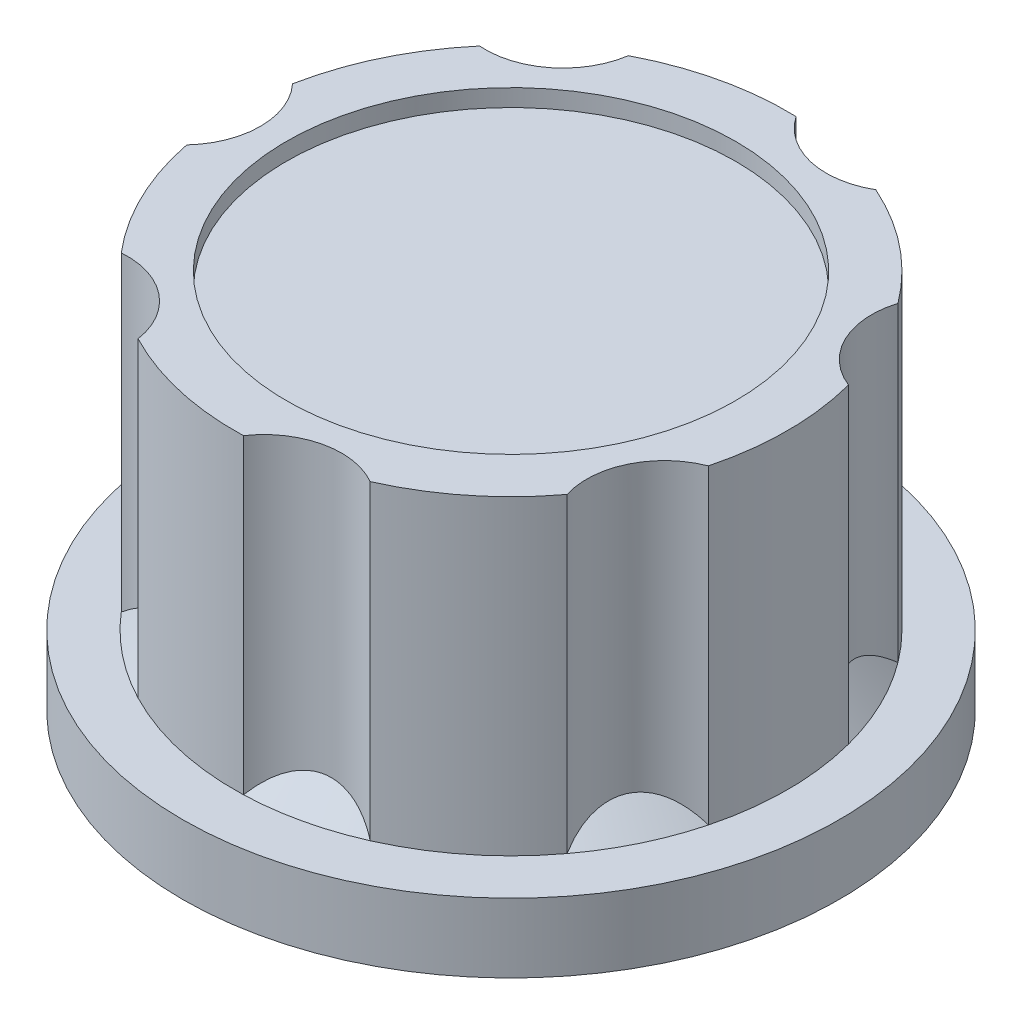
ISO-10303-21;
HEADER;
FILE_DESCRIPTION(('STEP AP214'),'2;1');
FILE_NAME('part.step','',(''),(''),'','','');
FILE_SCHEMA(('AUTOMOTIVE_DESIGN { 1 0 10303 214 1 1 1 1 }'));
ENDSEC;
DATA;
#1=APPLICATION_CONTEXT('core data for automotive mechanical design processes');
#2=APPLICATION_PROTOCOL_DEFINITION('international standard','automotive_design',2000,#1);
#3=PRODUCT_CONTEXT('',#1,'mechanical');
#4=PRODUCT('Part','Part','',(#3));
#5=PRODUCT_RELATED_PRODUCT_CATEGORY('part','',(#4));
#6=PRODUCT_DEFINITION_FORMATION('','',#4);
#7=PRODUCT_DEFINITION_CONTEXT('part definition',#1,'design');
#8=PRODUCT_DEFINITION('design','',#6,#7);
#9=PRODUCT_DEFINITION_SHAPE('','',#8);
#10=(LENGTH_UNIT() NAMED_UNIT(*) SI_UNIT(.MILLI.,.METRE.));
#11=(NAMED_UNIT(*) PLANE_ANGLE_UNIT() SI_UNIT($,.RADIAN.));
#12=(NAMED_UNIT(*) SI_UNIT($,.STERADIAN.) SOLID_ANGLE_UNIT());
#13=UNCERTAINTY_MEASURE_WITH_UNIT(LENGTH_MEASURE(1.E-05),#10,'distance_accuracy_value','');
#14=(GEOMETRIC_REPRESENTATION_CONTEXT(3) GLOBAL_UNCERTAINTY_ASSIGNED_CONTEXT((#13)) GLOBAL_UNIT_ASSIGNED_CONTEXT((#10,
#11,#12)) REPRESENTATION_CONTEXT('',''));
#15=CARTESIAN_POINT('',(0.,0.,0.));
#16=DIRECTION('',(0.,0.,1.));
#17=DIRECTION('',(1.,0.,0.));
#18=AXIS2_PLACEMENT_3D('',#15,#16,#17);
#19=CARTESIAN_POINT('',(0.,0.,0.));
#20=DIRECTION('',(0.,-1.,0.));
#21=DIRECTION('',(0.,0.,-1.));
#22=AXIS2_PLACEMENT_3D('',#19,#20,#21);
#23=CYLINDRICAL_SURFACE('',#22,8.);
#24=DIRECTION('',(0.,1.,0.));
#25=VECTOR('',#24,1.);
#26=CARTESIAN_POINT('',(3.24065428680593,7.25,7.31424362414914));
#27=LINE('',#26,#25);
#28=CARTESIAN_POINT('',(3.24065428680592,11.,7.31424362414914));
#29=VERTEX_POINT('',#28);
#30=CARTESIAN_POINT('',(3.24065428680593,2.,7.31424362414914));
#31=VERTEX_POINT('',#30);
#32=EDGE_CURVE('E130',#29,#31,#27,.F.);
#33=ORIENTED_EDGE('',*,*,#32,.T.);
#34=CARTESIAN_POINT('',(0.,2.,0.));
#35=DIRECTION('',(0.,-1.,0.));
#36=DIRECTION('',(0.,0.,-1.));
#37=AXIS2_PLACEMENT_3D('',#34,#35,#36);
#38=CIRCLE('',#37,8.);
#39=CARTESIAN_POINT('',(6.40974684715135,1.99999999999999,4.78697664036847));
#40=VERTEX_POINT('',#39);
#41=EDGE_CURVE('E302',#40,#31,#38,.T.);
#42=ORIENTED_EDGE('',*,*,#41,.F.);
#43=DIRECTION('',(0.,1.,0.));
#44=VECTOR('',#43,1.);
#45=CARTESIAN_POINT('',(6.40974684715135,7.25,4.78697664036846));
#46=LINE('',#45,#44);
#47=CARTESIAN_POINT('',(6.40974684715135,11.,4.78697664036846));
#48=VERTEX_POINT('',#47);
#49=EDGE_CURVE('E430',#40,#48,#46,.T.);
#50=ORIENTED_EDGE('',*,*,#49,.T.);
#51=CARTESIAN_POINT('',(0.,11.,0.));
#52=DIRECTION('',(0.,-1.,0.));
#53=DIRECTION('',(0.,0.,-1.));
#54=AXIS2_PLACEMENT_3D('',#51,#52,#53);
#55=CIRCLE('',#54,8.);
#56=EDGE_CURVE('E306',#48,#29,#55,.T.);
#57=ORIENTED_EDGE('',*,*,#56,.T.);
#58=EDGE_LOOP('',(#33,#42,#50,#57));
#59=FACE_BOUND('',#58,.T.);
#60=ADVANCED_FACE('F41',(#59),#23,.T.);
#61=CARTESIAN_POINT('',(0.253802748415934,1.99999999999999,7.99597299675884));
#62=VERTEX_POINT('',#61);
#63=CARTESIAN_POINT('',(-3.69799103662757,2.,7.09400185318711));
#64=VERTEX_POINT('',#63);
#65=EDGE_CURVE('E158',#62,#64,#38,.T.);
#66=ORIENTED_EDGE('',*,*,#65,.F.);
#67=DIRECTION('',(0.,1.,0.));
#68=VECTOR('',#67,1.);
#69=CARTESIAN_POINT('',(0.253802748415934,7.25,7.99597299675884));
#70=LINE('',#69,#68);
#71=CARTESIAN_POINT('',(0.253802748415933,11.,7.99597299675884));
#72=VERTEX_POINT('',#71);
#73=EDGE_CURVE('E311',#62,#72,#70,.T.);
#74=ORIENTED_EDGE('',*,*,#73,.T.);
#75=CARTESIAN_POINT('',(-3.69799103662758,11.,7.09400185318711));
#76=VERTEX_POINT('',#75);
#77=EDGE_CURVE('E467',#72,#76,#55,.T.);
#78=ORIENTED_EDGE('',*,*,#77,.T.);
#79=DIRECTION('',(0.,1.,0.));
#80=VECTOR('',#79,1.);
#81=CARTESIAN_POINT('',(-3.69799103662757,7.25,7.09400185318711));
#82=LINE('',#81,#80);
#83=EDGE_CURVE('E131',#76,#64,#82,.F.);
#84=ORIENTED_EDGE('',*,*,#83,.T.);
#85=EDGE_LOOP('',(#66,#74,#78,#84));
#86=FACE_BOUND('',#85,.T.);
#87=ADVANCED_FACE('F291',(#86),#23,.T.);
#88=CARTESIAN_POINT('',(-6.09325999650924,1.99999999999999,5.18383859846544));
#89=VERTEX_POINT('',#88);
#90=CARTESIAN_POINT('',(-7.85197368421053,2.,1.53183199550909));
#91=VERTEX_POINT('',#90);
#92=EDGE_CURVE('E143',#89,#91,#38,.T.);
#93=ORIENTED_EDGE('',*,*,#92,.F.);
#94=DIRECTION('',(0.,1.,0.));
#95=VECTOR('',#94,1.);
#96=CARTESIAN_POINT('',(-6.09325999650924,7.25,5.18383859846544));
#97=LINE('',#96,#95);
#98=CARTESIAN_POINT('',(-6.09325999650924,11.,5.18383859846544));
#99=VERTEX_POINT('',#98);
#100=EDGE_CURVE('E116',#89,#99,#97,.T.);
#101=ORIENTED_EDGE('',*,*,#100,.T.);
#102=CARTESIAN_POINT('',(-7.85197368421053,11.,1.53183199550909));
#103=VERTEX_POINT('',#102);
#104=EDGE_CURVE('E399',#99,#103,#55,.T.);
#105=ORIENTED_EDGE('',*,*,#104,.T.);
#106=DIRECTION('',(0.,1.,0.));
#107=VECTOR('',#106,1.);
#108=CARTESIAN_POINT('',(-7.85197368421052,7.25,1.53183199550909));
#109=LINE('',#108,#107);
#110=EDGE_CURVE('E146',#103,#91,#109,.F.);
#111=ORIENTED_EDGE('',*,*,#110,.T.);
#112=EDGE_LOOP('',(#93,#101,#105,#111));
#113=FACE_BOUND('',#112,.T.);
#114=ADVANCED_FACE('F144',(#113),#23,.T.);
#115=CARTESIAN_POINT('',(-7.85197368421053,1.99999999999999,-1.53183199550909));
#116=VERTEX_POINT('',#115);
#117=CARTESIAN_POINT('',(-6.09325999650925,2.,-5.18383859846544));
#118=VERTEX_POINT('',#117);
#119=EDGE_CURVE('E385',#116,#118,#38,.T.);
#120=ORIENTED_EDGE('',*,*,#119,.F.);
#121=DIRECTION('',(0.,1.,0.));
#122=VECTOR('',#121,1.);
#123=CARTESIAN_POINT('',(-7.85197368421052,7.25,-1.53183199550909));
#124=LINE('',#123,#122);
#125=CARTESIAN_POINT('',(-7.85197368421052,11.,-1.53183199550909));
#126=VERTEX_POINT('',#125);
#127=EDGE_CURVE('E440',#116,#126,#124,.T.);
#128=ORIENTED_EDGE('',*,*,#127,.T.);
#129=CARTESIAN_POINT('',(-6.09325999650924,11.,-5.18383859846544));
#130=VERTEX_POINT('',#129);
#131=EDGE_CURVE('E392',#126,#130,#55,.T.);
#132=ORIENTED_EDGE('',*,*,#131,.T.);
#133=DIRECTION('',(0.,1.,0.));
#134=VECTOR('',#133,1.);
#135=CARTESIAN_POINT('',(-6.09325999650924,7.25,-5.18383859846544));
#136=LINE('',#135,#134);
#137=EDGE_CURVE('E418',#130,#118,#136,.F.);
#138=ORIENTED_EDGE('',*,*,#137,.T.);
#139=EDGE_LOOP('',(#120,#128,#132,#138));
#140=FACE_BOUND('',#139,.T.);
#141=ADVANCED_FACE('F495',(#140),#23,.T.);
#142=CARTESIAN_POINT('',(-3.69799103662758,1.99999999999999,-7.09400185318711));
#143=VERTEX_POINT('',#142);
#144=CARTESIAN_POINT('',(0.253802748415931,2.,-7.99597299675884));
#145=VERTEX_POINT('',#144);
#146=EDGE_CURVE('E168',#143,#145,#38,.T.);
#147=ORIENTED_EDGE('',*,*,#146,.F.);
#148=DIRECTION('',(0.,1.,0.));
#149=VECTOR('',#148,1.);
#150=CARTESIAN_POINT('',(-3.69799103662758,7.25,-7.09400185318711));
#151=LINE('',#150,#149);
#152=CARTESIAN_POINT('',(-3.69799103662758,11.,-7.09400185318711));
#153=VERTEX_POINT('',#152);
#154=EDGE_CURVE('E66',#143,#153,#151,.T.);
#155=ORIENTED_EDGE('',*,*,#154,.T.);
#156=CARTESIAN_POINT('',(0.253802748415935,11.,-7.99597299675884));
#157=VERTEX_POINT('',#156);
#158=EDGE_CURVE('E169',#153,#157,#55,.T.);
#159=ORIENTED_EDGE('',*,*,#158,.T.);
#160=DIRECTION('',(0.,1.,0.));
#161=VECTOR('',#160,1.);
#162=CARTESIAN_POINT('',(0.253802748415931,7.25,-7.99597299675884));
#163=LINE('',#162,#161);
#164=EDGE_CURVE('E423',#157,#145,#163,.F.);
#165=ORIENTED_EDGE('',*,*,#164,.T.);
#166=EDGE_LOOP('',(#147,#155,#159,#165));
#167=FACE_BOUND('',#166,.T.);
#168=ADVANCED_FACE('F501',(#167),#23,.T.);
#169=CARTESIAN_POINT('',(3.24065428680593,1.99999999999999,-7.31424362414914));
#170=VERTEX_POINT('',#169);
#171=CARTESIAN_POINT('',(6.40974684715135,2.,-4.78697664036847));
#172=VERTEX_POINT('',#171);
#173=EDGE_CURVE('E167',#170,#172,#38,.T.);
#174=ORIENTED_EDGE('',*,*,#173,.F.);
#175=DIRECTION('',(0.,1.,0.));
#176=VECTOR('',#175,1.);
#177=CARTESIAN_POINT('',(3.24065428680593,7.25,-7.31424362414914));
#178=LINE('',#177,#176);
#179=CARTESIAN_POINT('',(3.24065428680593,11.,-7.31424362414914));
#180=VERTEX_POINT('',#179);
#181=EDGE_CURVE('E370',#170,#180,#178,.T.);
#182=ORIENTED_EDGE('',*,*,#181,.T.);
#183=CARTESIAN_POINT('',(6.40974684715135,11.,-4.78697664036846));
#184=VERTEX_POINT('',#183);
#185=EDGE_CURVE('E382',#180,#184,#55,.T.);
#186=ORIENTED_EDGE('',*,*,#185,.T.);
#187=DIRECTION('',(0.,1.,0.));
#188=VECTOR('',#187,1.);
#189=CARTESIAN_POINT('',(6.40974684715135,7.25,-4.78697664036846));
#190=LINE('',#189,#188);
#191=EDGE_CURVE('E95',#184,#172,#190,.F.);
#192=ORIENTED_EDGE('',*,*,#191,.T.);
#193=EDGE_LOOP('',(#174,#182,#186,#192));
#194=FACE_BOUND('',#193,.T.);
#195=ADVANCED_FACE('F278',(#194),#23,.T.);
#196=CARTESIAN_POINT('',(0.,0.,0.));
#197=DIRECTION('',(0.,1.,0.));
#198=DIRECTION('',(0.,0.,1.));
#199=AXIS2_PLACEMENT_3D('',#196,#197,#198);
#200=PLANE('',#199);
#201=CARTESIAN_POINT('',(0.,0.,0.));
#202=DIRECTION('',(0.,-1.,0.));
#203=DIRECTION('',(0.,0.,-1.));
#204=AXIS2_PLACEMENT_3D('',#201,#202,#203);
#205=CIRCLE('',#204,3.6);
#206=CARTESIAN_POINT('',(0.,0.,-3.6));
#207=VERTEX_POINT('',#206);
#208=EDGE_CURVE('E409',#207,#207,#205,.T.);
#209=ORIENTED_EDGE('',*,*,#208,.F.);
#210=EDGE_LOOP('',(#209));
#211=FACE_BOUND('',#210,.T.);
#212=CARTESIAN_POINT('',(0.,0.,0.));
#213=DIRECTION('',(0.,-1.,0.));
#214=DIRECTION('',(0.,0.,-1.));
#215=AXIS2_PLACEMENT_3D('',#212,#213,#214);
#216=CIRCLE('',#215,9.5);
#217=CARTESIAN_POINT('',(0.,0.,-9.5));
#218=VERTEX_POINT('',#217);
#219=EDGE_CURVE('E174',#218,#218,#216,.T.);
#220=ORIENTED_EDGE('',*,*,#219,.T.);
#221=EDGE_LOOP('',(#220));
#222=FACE_BOUND('',#221,.T.);
#223=ADVANCED_FACE('F213',(#211,#222),#200,.F.);
#224=CARTESIAN_POINT('',(0.,0.,0.));
#225=DIRECTION('',(0.,-1.,0.));
#226=DIRECTION('',(0.,0.,-1.));
#227=AXIS2_PLACEMENT_3D('',#224,#225,#226);
#228=CYLINDRICAL_SURFACE('',#227,9.5);
#229=ORIENTED_EDGE('',*,*,#219,.F.);
#230=EDGE_LOOP('',(#229));
#231=FACE_BOUND('',#230,.T.);
#232=CARTESIAN_POINT('',(0.,2.,0.));
#233=DIRECTION('',(0.,-1.,0.));
#234=DIRECTION('',(0.,0.,-1.));
#235=AXIS2_PLACEMENT_3D('',#232,#233,#234);
#236=CIRCLE('',#235,9.5);
#237=CARTESIAN_POINT('',(0.,2.,-9.5));
#238=VERTEX_POINT('',#237);
#239=EDGE_CURVE('E166',#238,#238,#236,.T.);
#240=ORIENTED_EDGE('',*,*,#239,.T.);
#241=EDGE_LOOP('',(#240));
#242=FACE_BOUND('',#241,.T.);
#243=ADVANCED_FACE('F280',(#231,#242),#228,.T.);
#244=CARTESIAN_POINT('',(0.,2.,9.5));
#245=DIRECTION('',(0.,-1.,0.));
#246=DIRECTION('',(0.,0.,-1.));
#247=AXIS2_PLACEMENT_3D('',#244,#245,#246);
#248=PLANE('',#247);
#249=ORIENTED_EDGE('',*,*,#239,.F.);
#250=EDGE_LOOP('',(#249));
#251=FACE_BOUND('',#250,.T.);
#252=EDGE_CURVE('E162',#145,#170,#38,.T.);
#253=ORIENTED_EDGE('',*,*,#252,.T.);
#254=ORIENTED_EDGE('',*,*,#173,.T.);
#255=CARTESIAN_POINT('',(7.73902083497414,1.99999999999999,-2.0267107627474));
#256=VERTEX_POINT('',#255);
#257=EDGE_CURVE('E325',#172,#256,#38,.T.);
#258=ORIENTED_EDGE('',*,*,#257,.T.);
#259=CARTESIAN_POINT('',(7.73902083497414,2.,2.0267107627474));
#260=VERTEX_POINT('',#259);
#261=EDGE_CURVE('E323',#256,#260,#38,.T.);
#262=ORIENTED_EDGE('',*,*,#261,.T.);
#263=EDGE_CURVE('E318',#260,#40,#38,.T.);
#264=ORIENTED_EDGE('',*,*,#263,.T.);
#265=ORIENTED_EDGE('',*,*,#41,.T.);
#266=EDGE_CURVE('E161',#31,#62,#38,.T.);
#267=ORIENTED_EDGE('',*,*,#266,.T.);
#268=ORIENTED_EDGE('',*,*,#65,.T.);
#269=EDGE_CURVE('E137',#64,#89,#38,.T.);
#270=ORIENTED_EDGE('',*,*,#269,.T.);
#271=ORIENTED_EDGE('',*,*,#92,.T.);
#272=EDGE_CURVE('E152',#91,#116,#38,.T.);
#273=ORIENTED_EDGE('',*,*,#272,.T.);
#274=ORIENTED_EDGE('',*,*,#119,.T.);
#275=EDGE_CURVE('E377',#118,#143,#38,.T.);
#276=ORIENTED_EDGE('',*,*,#275,.T.);
#277=ORIENTED_EDGE('',*,*,#146,.T.);
#278=EDGE_LOOP('',(#253,#254,#258,#262,#264,#265,#267,#268,#270,#271,#273,#274,#276,#277));
#279=FACE_BOUND('',#278,.T.);
#280=ADVANCED_FACE('F155',(#251,#279),#248,.F.);
#281=ORIENTED_EDGE('',*,*,#261,.F.);
#282=DIRECTION('',(0.,1.,0.));
#283=VECTOR('',#282,1.);
#284=CARTESIAN_POINT('',(7.73902083497414,7.25,-2.0267107627474));
#285=LINE('',#284,#283);
#286=CARTESIAN_POINT('',(7.73902083497414,11.,-2.0267107627474));
#287=VERTEX_POINT('',#286);
#288=EDGE_CURVE('E85',#256,#287,#285,.T.);
#289=ORIENTED_EDGE('',*,*,#288,.T.);
#290=CARTESIAN_POINT('',(7.73902083497414,11.,2.0267107627474));
#291=VERTEX_POINT('',#290);
#292=EDGE_CURVE('E386',#287,#291,#55,.T.);
#293=ORIENTED_EDGE('',*,*,#292,.T.);
#294=DIRECTION('',(0.,1.,0.));
#295=VECTOR('',#294,1.);
#296=CARTESIAN_POINT('',(7.73902083497414,7.25,2.0267107627474));
#297=LINE('',#296,#295);
#298=EDGE_CURVE('E433',#291,#260,#297,.F.);
#299=ORIENTED_EDGE('',*,*,#298,.T.);
#300=EDGE_LOOP('',(#281,#289,#293,#299));
#301=FACE_BOUND('',#300,.T.);
#302=ADVANCED_FACE('F273',(#301),#23,.T.);
#303=CARTESIAN_POINT('',(0.,11.,8.));
#304=DIRECTION('',(0.,-1.,0.));
#305=DIRECTION('',(0.,0.,-1.));
#306=AXIS2_PLACEMENT_3D('',#303,#304,#305);
#307=PLANE('',#306);
#308=ORIENTED_EDGE('',*,*,#158,.F.);
#309=CARTESIAN_POINT('',(-5.92315311765797,11.,-7.42739908344628));
#310=DIRECTION('',(0.,-1.,0.));
#311=DIRECTION('',(0.,0.,-1.));
#312=AXIS2_PLACEMENT_3D('',#309,#310,#311);
#313=CIRCLE('',#312,2.25);
#314=EDGE_CURVE('E182',#153,#130,#313,.T.);
#315=ORIENTED_EDGE('',*,*,#314,.T.);
#316=ORIENTED_EDGE('',*,*,#131,.F.);
#317=CARTESIAN_POINT('',(-9.5,11.,0.));
#318=DIRECTION('',(0.,1.,0.));
#319=DIRECTION('',(0.,0.,1.));
#320=AXIS2_PLACEMENT_3D('',#317,#318,#319);
#321=CIRCLE('',#320,2.25);
#322=EDGE_CURVE('E446',#103,#126,#321,.T.);
#323=ORIENTED_EDGE('',*,*,#322,.F.);
#324=ORIENTED_EDGE('',*,*,#104,.F.);
#325=CARTESIAN_POINT('',(-5.92315311765797,11.,7.42739908344628));
#326=DIRECTION('',(0.,1.,0.));
#327=DIRECTION('',(0.,0.,1.));
#328=AXIS2_PLACEMENT_3D('',#325,#326,#327);
#329=CIRCLE('',#328,2.25);
#330=EDGE_CURVE('E124',#76,#99,#329,.T.);
#331=ORIENTED_EDGE('',*,*,#330,.F.);
#332=ORIENTED_EDGE('',*,*,#77,.F.);
#333=CARTESIAN_POINT('',(2.11394887258499,11.,9.26181516572732));
#334=DIRECTION('',(0.,1.,0.));
#335=DIRECTION('',(0.,0.,1.));
#336=AXIS2_PLACEMENT_3D('',#333,#334,#335);
#337=CIRCLE('',#336,2.25);
#338=EDGE_CURVE('E455',#29,#72,#337,.T.);
#339=ORIENTED_EDGE('',*,*,#338,.F.);
#340=ORIENTED_EDGE('',*,*,#56,.F.);
#341=CARTESIAN_POINT('',(8.55920424507298,11.,4.1218955216168));
#342=DIRECTION('',(0.,1.,0.));
#343=DIRECTION('',(0.,0.,1.));
#344=AXIS2_PLACEMENT_3D('',#341,#342,#343);
#345=CIRCLE('',#344,2.25);
#346=EDGE_CURVE('E451',#291,#48,#345,.T.);
#347=ORIENTED_EDGE('',*,*,#346,.F.);
#348=ORIENTED_EDGE('',*,*,#292,.F.);
#349=CARTESIAN_POINT('',(8.55920424507298,11.,-4.1218955216168));
#350=DIRECTION('',(0.,1.,0.));
#351=DIRECTION('',(0.,0.,1.));
#352=AXIS2_PLACEMENT_3D('',#349,#350,#351);
#353=CIRCLE('',#352,2.25);
#354=EDGE_CURVE('E450',#184,#287,#353,.T.);
#355=ORIENTED_EDGE('',*,*,#354,.F.);
#356=ORIENTED_EDGE('',*,*,#185,.F.);
#357=CARTESIAN_POINT('',(2.11394887258499,11.,-9.26181516572732));
#358=DIRECTION('',(0.,-1.,0.));
#359=DIRECTION('',(0.,0.,-1.));
#360=AXIS2_PLACEMENT_3D('',#357,#358,#359);
#361=CIRCLE('',#360,2.25);
#362=EDGE_CURVE('E178',#180,#157,#361,.T.);
#363=ORIENTED_EDGE('',*,*,#362,.T.);
#364=EDGE_LOOP('',(#308,#315,#316,#323,#324,#331,#332,#339,#340,#347,#348,#355,#356,#363));
#365=FACE_BOUND('',#364,.T.);
#366=CARTESIAN_POINT('',(0.,11.,0.));
#367=DIRECTION('',(0.,-1.,0.));
#368=DIRECTION('',(0.,0.,-1.));
#369=AXIS2_PLACEMENT_3D('',#366,#367,#368);
#370=CIRCLE('',#369,6.5);
#371=CARTESIAN_POINT('',(0.,11.,-6.5));
#372=VERTEX_POINT('',#371);
#373=EDGE_CURVE('E393',#372,#372,#370,.T.);
#374=ORIENTED_EDGE('',*,*,#373,.T.);
#375=EDGE_LOOP('',(#374));
#376=FACE_BOUND('',#375,.T.);
#377=ADVANCED_FACE('F269',(#365,#376),#307,.F.);
#378=CARTESIAN_POINT('',(0.,0.,0.));
#379=DIRECTION('',(0.,-1.,0.));
#380=DIRECTION('',(0.,0.,-1.));
#381=AXIS2_PLACEMENT_3D('',#378,#379,#380);
#382=CYLINDRICAL_SURFACE('',#381,6.5);
#383=ORIENTED_EDGE('',*,*,#373,.F.);
#384=EDGE_LOOP('',(#383));
#385=FACE_BOUND('',#384,.T.);
#386=CARTESIAN_POINT('',(0.,10.5,0.));
#387=DIRECTION('',(0.,-1.,0.));
#388=DIRECTION('',(0.,0.,-1.));
#389=AXIS2_PLACEMENT_3D('',#386,#387,#388);
#390=CIRCLE('',#389,6.5);
#391=CARTESIAN_POINT('',(0.,10.5,-6.5));
#392=VERTEX_POINT('',#391);
#393=EDGE_CURVE('E401',#392,#392,#390,.T.);
#394=ORIENTED_EDGE('',*,*,#393,.T.);
#395=EDGE_LOOP('',(#394));
#396=FACE_BOUND('',#395,.T.);
#397=ADVANCED_FACE('F265',(#385,#396),#382,.F.);
#398=CARTESIAN_POINT('',(0.,10.5,6.5));
#399=DIRECTION('',(0.,-1.,0.));
#400=DIRECTION('',(0.,0.,-1.));
#401=AXIS2_PLACEMENT_3D('',#398,#399,#400);
#402=PLANE('',#401);
#403=ORIENTED_EDGE('',*,*,#393,.F.);
#404=EDGE_LOOP('',(#403));
#405=FACE_BOUND('',#404,.T.);
#406=ADVANCED_FACE('F261',(#405),#402,.F.);
#407=CARTESIAN_POINT('',(0.,10.,0.));
#408=DIRECTION('',(0.,-1.,0.));
#409=DIRECTION('',(0.,0.,-1.));
#410=AXIS2_PLACEMENT_3D('',#407,#408,#409);
#411=CYLINDRICAL_SURFACE('',#410,3.6);
#412=CARTESIAN_POINT('',(0.,10.,0.));
#413=DIRECTION('',(0.,-1.,0.));
#414=DIRECTION('',(0.,0.,-1.));
#415=AXIS2_PLACEMENT_3D('',#412,#413,#414);
#416=CIRCLE('',#415,3.6);
#417=CARTESIAN_POINT('',(0.,10.,-3.6));
#418=VERTEX_POINT('',#417);
#419=EDGE_CURVE('E406',#418,#418,#416,.T.);
#420=ORIENTED_EDGE('',*,*,#419,.F.);
#421=EDGE_LOOP('',(#420));
#422=FACE_BOUND('',#421,.T.);
#423=ORIENTED_EDGE('',*,*,#208,.T.);
#424=EDGE_LOOP('',(#423));
#425=FACE_BOUND('',#424,.T.);
#426=ADVANCED_FACE('F257',(#422,#425),#411,.F.);
#427=CARTESIAN_POINT('',(0.,10.,0.));
#428=DIRECTION('',(0.,-1.,0.));
#429=DIRECTION('',(0.,0.,-1.));
#430=AXIS2_PLACEMENT_3D('',#427,#428,#429);
#431=PLANE('',#430);
#432=ORIENTED_EDGE('',*,*,#419,.T.);
#433=EDGE_LOOP('',(#432));
#434=FACE_BOUND('',#433,.T.);
#435=ADVANCED_FACE('F250',(#434),#431,.T.);
#436=CARTESIAN_POINT('',(-9.5,3.5,0.));
#437=DIRECTION('',(0.,1.,0.));
#438=DIRECTION('',(0.,0.,1.));
#439=AXIS2_PLACEMENT_3D('',#436,#437,#438);
#440=CYLINDRICAL_SURFACE('',#439,2.25);
#441=ORIENTED_EDGE('',*,*,#127,.F.);
#442=CARTESIAN_POINT('',(-7.85197368421053,1.99999999999999,-1.53183199550909));
#443=CARTESIAN_POINT('',(-7.81642060818269,2.04221523877648,-1.49356924193699));
#444=CARTESIAN_POINT('',(-7.78176435249432,2.08370773629879,-1.45362436259319));
#445=CARTESIAN_POINT('',(-7.71446424762265,2.16488957282138,-1.37012953023777));
#446=CARTESIAN_POINT('',(-7.68182498397619,2.20457475275706,-1.32657185443774));
#447=CARTESIAN_POINT('',(-7.61849949664696,2.2821299612134,-1.23514661944881));
#448=CARTESIAN_POINT('',(-7.58784670477565,2.319967113671,-1.18722759214792));
#449=CARTESIAN_POINT('',(-7.52943679482667,2.39256177492294,-1.08752790661318));
#450=CARTESIAN_POINT('',(-7.50167710565157,2.42732201395519,-1.03575074851369));
#451=CARTESIAN_POINT('',(-7.43909227007453,2.50617861860053,-0.906725744740329));
#452=CARTESIAN_POINT('',(-7.4058646818956,2.54846952071955,-0.82755524030413));
#453=CARTESIAN_POINT('',(-7.34782774634592,2.62283154212814,-0.662032760497732));
#454=CARTESIAN_POINT('',(-7.32297865648131,2.65495086376943,-0.575717178837806));
#455=CARTESIAN_POINT('',(-7.2866042440625,2.70216126704578,-0.411427543372473));
#456=CARTESIAN_POINT('',(-7.27357919812251,2.7191597100009,-0.334343185872719));
#457=CARTESIAN_POINT('',(-7.25563686623551,2.74260757629917,-0.177605059303222));
#458=CARTESIAN_POINT('',(-7.25071931177487,2.7490573490058,-0.0979513754165993));
#459=CARTESIAN_POINT('',(-7.24945608805918,2.75071281344274,0.058070864000016));
#460=CARTESIAN_POINT('',(-7.25274712971202,2.74639504731885,0.134431724336845));
#461=CARTESIAN_POINT('',(-7.26685824239063,2.72793787197817,0.285168051794073));
#462=CARTESIAN_POINT('',(-7.27767613165328,2.71380130888045,0.35954408775853));
#463=CARTESIAN_POINT('',(-7.31355259055777,2.66714325027505,0.542794852706255));
#464=CARTESIAN_POINT('',(-7.34310201800649,2.62887074964845,0.649338853980878));
#465=CARTESIAN_POINT('',(-7.41465937909287,2.53721766829628,0.851798636640746));
#466=CARTESIAN_POINT('',(-7.45676617469346,2.48371736008114,0.947621455818019));
#467=CARTESIAN_POINT('',(-7.55334099759938,2.36260037698449,1.13343543435971));
#468=CARTESIAN_POINT('',(-7.60843675547127,2.29428994071175,1.222636950424));
#469=CARTESIAN_POINT('',(-7.69646796771129,2.18676374560345,1.34620553322208));
#470=CARTESIAN_POINT('',(-7.72641506101122,2.15042921168721,1.38537960445795));
#471=CARTESIAN_POINT('',(-7.78798073579715,2.0762692863576,1.46076926180161));
#472=CARTESIAN_POINT('',(-7.81959703958487,2.03844594354868,1.49698871608176));
#473=CARTESIAN_POINT('',(-7.85197368421052,1.99999999999999,1.5318319955091));
#474=B_SPLINE_CURVE_WITH_KNOTS('',3,(#442,#443,#444,#445,#446,#447,#448,#449,#450,#451,#452,
#453,#454,#455,#456,#457,#458,#459,#460,#461,#462,#463,#464,#465,#466,#467,#468,#469,#470,#471,
#472,#473),.UNSPECIFIED.,.F.,.F.,(4,2,2,2,2,2,2,2,2,2,2,2,2,2,2,4),(0.,0.201485564486862,
0.403413513575964,0.608146730817166,0.812696421890055,1.09882489345934,1.38357639768856,
1.6225518423589,1.86151937219475,2.09010010862697,2.31861461529165,2.66679793551903,
3.01779825067232,3.39172345464263,3.57539027926865,3.75881265442483),.UNSPECIFIED.);
#475=EDGE_CURVE('E139',#116,#91,#474,.T.);
#476=ORIENTED_EDGE('',*,*,#475,.T.);
#477=ORIENTED_EDGE('',*,*,#110,.F.);
#478=ORIENTED_EDGE('',*,*,#322,.T.);
#479=EDGE_LOOP('',(#441,#476,#477,#478));
#480=FACE_BOUND('',#479,.T.);
#481=ADVANCED_FACE('F246',(#480),#440,.F.);
#482=CARTESIAN_POINT('',(-5.92315311765797,3.5,7.42739908344628));
#483=DIRECTION('',(0.,1.,0.));
#484=DIRECTION('',(0.,0.,1.));
#485=AXIS2_PLACEMENT_3D('',#482,#483,#484);
#486=CYLINDRICAL_SURFACE('',#485,2.25);
#487=ORIENTED_EDGE('',*,*,#100,.F.);
#488=CARTESIAN_POINT('',(-6.09325999650924,1.99999999999999,5.18383859846544));
#489=CARTESIAN_POINT('',(-6.04117799083259,2.04221523877648,5.17989852097154));
#490=CARTESIAN_POINT('',(-5.98834000460592,2.08370773629879,5.17770839411725));
#491=CARTESIAN_POINT('',(-5.88110018699555,2.16488957282138,5.17714922983669));
#492=CARTESIAN_POINT('',(-5.8266951767282,2.20457475275706,5.1787885926073));
#493=CARTESIAN_POINT('',(-5.71573325417431,2.2821299612134,5.18628143461881));
#494=CARTESIAN_POINT('',(-5.65915694689098,2.319967113671,5.19219314174538));
#495=CARTESIAN_POINT('',(-5.54479061076708,2.39256177492294,5.20868817243857));
#496=CARTESIAN_POINT('',(-5.48700171538872,2.42732201395519,5.21926730354222));
#497=CARTESIAN_POINT('',(-5.34710489867986,2.50617861860053,5.25078228280047));
#498=CARTESIAN_POINT('',(-5.26448984345884,2.54846952071955,5.27416591039968));
#499=CARTESIAN_POINT('',(-5.09889372024366,2.62283154212814,5.33199238517863));
#500=CARTESIAN_POINT('',(-5.01591632695834,2.65495086376943,5.36638146931827));
#501=CARTESIAN_POINT('',(-4.86479044251661,2.70216126704578,5.44037572079669));
#502=CARTESIAN_POINT('',(-4.79640248170516,2.7191597100009,5.47825364060415));
#503=CARTESIAN_POINT('',(-4.66267281889696,2.74260757629917,5.56195038414453));
#504=CARTESIAN_POINT('',(-4.59733101608355,2.7490573490058,5.60776894483423));
#505=CARTESIAN_POINT('',(-4.47456031023828,2.75071281344274,5.70405959190333));
#506=CARTESIAN_POINT('',(-4.41691091650664,2.74639504731885,5.75424284955881));
#507=CARTESIAN_POINT('',(-4.30785864499696,2.72793787197817,5.85925792464281));
#508=CARTESIAN_POINT('',(-4.25645396217167,2.71380130888045,5.91408839096872));
#509=CARTESIAN_POINT('',(-4.13555135120295,2.66714325027506,6.05639271914744));
#510=CARTESIAN_POINT('',(-4.07067566340338,2.62887074964846,6.14592449005971));
#511=CARTESIAN_POINT('',(-3.95700151627154,2.53721766829628,6.32810189753433));
#512=CARTESIAN_POINT('',(-3.90833737714582,2.48371736008114,6.4207668665031));
#513=CARTESIAN_POINT('',(-3.82327557603744,2.3626003769845,6.61212522412827));
#514=CARTESIAN_POINT('',(-3.7878866656533,2.29428994071176,6.71081705775937));
#515=CARTESIAN_POINT('',(-3.74616342045472,2.18676374560345,6.85668638213318));
#516=CARTESIAN_POINT('',(-3.73420760553388,2.15042921168721,6.90452459639633));
#517=CARTESIAN_POINT('',(-3.71365116834372,2.0762692863576,6.99966326170276));
#518=CARTESIAN_POINT('',(-3.7050461016938,2.03844594354868,7.04696434373583));
#519=CARTESIAN_POINT('',(-3.69799103662757,1.99999999999999,7.09400185318711));
#520=B_SPLINE_CURVE_WITH_KNOTS('',3,(#488,#489,#490,#491,#492,#493,#494,#495,#496,#497,#498,
#499,#500,#501,#502,#503,#504,#505,#506,#507,#508,#509,#510,#511,#512,#513,#514,#515,#516,#517,
#518,#519),.UNSPECIFIED.,.F.,.F.,(4,2,2,2,2,2,2,2,2,2,2,2,2,2,2,4),(0.,0.201485564486862,
0.403413513575964,0.608146730817165,0.812696421890054,1.09882489345934,1.38357639768856,
1.6225518423589,1.86151937219474,2.09010010862696,2.31861461529164,2.66679793551902,
3.01779825067231,3.39172345464262,3.57539027926865,3.75881265442482),.UNSPECIFIED.);
#521=EDGE_CURVE('E120',#89,#64,#520,.T.);
#522=ORIENTED_EDGE('',*,*,#521,.T.);
#523=ORIENTED_EDGE('',*,*,#83,.F.);
#524=ORIENTED_EDGE('',*,*,#330,.T.);
#525=EDGE_LOOP('',(#487,#522,#523,#524));
#526=FACE_BOUND('',#525,.T.);
#527=ADVANCED_FACE('F118',(#526),#486,.F.);
#528=CARTESIAN_POINT('',(2.11394887258499,3.5,9.26181516572733));
#529=DIRECTION('',(0.,1.,0.));
#530=DIRECTION('',(0.,0.,1.));
#531=AXIS2_PLACEMENT_3D('',#528,#529,#530);
#532=CYLINDRICAL_SURFACE('',#531,2.25);
#533=ORIENTED_EDGE('',*,*,#73,.F.);
#534=CARTESIAN_POINT('',(0.253802748415934,1.99999999999999,7.99597299675884));
#535=CARTESIAN_POINT('',(0.283194871187582,2.04221523877647,7.95279704691477));
#536=CARTESIAN_POINT('',(0.314426506625379,2.08370773629879,7.91012112405412));
#537=CARTESIAN_POINT('',(0.380852267020222,2.16488957282138,7.82592902524571));
#538=CARTESIAN_POINT('',(0.416054941517181,2.20457475275706,7.78441560138372));
#539=CARTESIAN_POINT('',(0.491096708401929,2.2821299612134,7.70233378755703));
#540=CARTESIAN_POINT('',(0.530993417766597,2.319967113671,7.66178653846612));
#541=CARTESIAN_POINT('',(0.615195996316012,2.39256177492294,7.58265581976849));
#542=CARTESIAN_POINT('',(0.659497880999082,2.42732201395519,7.54407062238029));
#543=CARTESIAN_POINT('',(0.771361522482987,2.50617861860053,7.45434415495356));
#544=CARTESIAN_POINT('',(0.84115322312466,2.54846952071955,7.4043325571945));
#545=CARTESIAN_POINT('',(0.989611275678993,2.62283154212814,7.31091851199233));
#546=CARTESIAN_POINT('',(1.06823330281083,2.65495086376943,7.26748541684506));
#547=CARTESIAN_POINT('',(1.22030978588461,2.70216126704578,7.19546510376566));
#548=CARTESIAN_POINT('',(1.29256313221633,2.7191597100009,7.16561373969705));
#549=CARTESIAN_POINT('',(1.44137896226317,2.74260757629917,7.11324374521998));
#550=CARTESIAN_POINT('',(1.51794130318099,2.7490573490058,7.09072487198511));
#551=CARTESIAN_POINT('',(1.66977064558835,2.75071281344274,7.05477510549241));
#552=CARTESIAN_POINT('',(1.74494930539122,2.74639504731885,7.04099174390007));
#553=CARTESIAN_POINT('',(1.89504637638146,2.72793787197817,7.02120707315546));
#554=CARTESIAN_POINT('',(1.96996485666281,2.71380130888045,7.01520351036172));
#555=CARTESIAN_POINT('',(2.15660440548149,2.66714325027505,7.00940334017358));
#556=CARTESIAN_POINT('',(2.26705249239342,2.62887074964845,7.01450363111126));
#557=CARTESIAN_POINT('',(2.48035919642318,2.53721766829628,7.03921535983037));
#558=CARTESIAN_POINT('',(2.583149180946,2.48371736008114,7.05894386693627));
#559=CARTESIAN_POINT('',(2.78579433488955,2.36260037698449,7.11174985735404));
#560=CARTESIAN_POINT('',(2.88501934220824,2.29428994071175,7.1456150448812));
#561=CARTESIAN_POINT('',(3.02507859021179,2.18676374560345,7.20394253438532));
#562=CARTESIAN_POINT('',(3.06993434086382,2.15042921168721,7.22442174061385));
#563=CARTESIAN_POINT('',(3.15713347355099,2.0762692863576,7.26766805843221));
#564=CARTESIAN_POINT('',(3.19948011993979,2.03844594354868,7.29043208868107));
#565=CARTESIAN_POINT('',(3.24065428680593,1.99999999999999,7.31424362414914));
#566=B_SPLINE_CURVE_WITH_KNOTS('',3,(#534,#535,#536,#537,#538,#539,#540,#541,#542,#543,#544,
#545,#546,#547,#548,#549,#550,#551,#552,#553,#554,#555,#556,#557,#558,#559,#560,#561,#562,#563,
#564,#565),.UNSPECIFIED.,.F.,.F.,(4,2,2,2,2,2,2,2,2,2,2,2,2,2,2,4),(0.,0.201485564486862,
0.403413513575963,0.608146730817165,0.812696421890053,1.09882489345934,1.38357639768856,
1.6225518423589,1.86151937219474,2.09010010862697,2.31861461529165,2.66679793551903,
3.01779825067232,3.39172345464262,3.57539027926865,3.75881265442482),.UNSPECIFIED.);
#567=EDGE_CURVE('E140',#62,#31,#566,.T.);
#568=ORIENTED_EDGE('',*,*,#567,.T.);
#569=ORIENTED_EDGE('',*,*,#32,.F.);
#570=ORIENTED_EDGE('',*,*,#338,.T.);
#571=EDGE_LOOP('',(#533,#568,#569,#570));
#572=FACE_BOUND('',#571,.T.);
#573=ADVANCED_FACE('F201',(#572),#532,.F.);
#574=CARTESIAN_POINT('',(8.55920424507298,3.5,4.1218955216168));
#575=DIRECTION('',(0.,1.,0.));
#576=DIRECTION('',(0.,0.,1.));
#577=AXIS2_PLACEMENT_3D('',#574,#575,#576);
#578=CYLINDRICAL_SURFACE('',#577,2.25);
#579=ORIENTED_EDGE('',*,*,#49,.F.);
#580=CARTESIAN_POINT('',(6.40974684715135,1.99999999999999,4.78697664036847));
#581=CARTESIAN_POINT('',(6.39431621908089,2.04221523877648,4.73707718903569));
#582=CARTESIAN_POINT('',(6.3804234452359,2.08370773629879,4.68605131051293));
#583=CARTESIAN_POINT('',(6.35601519599932,2.16488957282138,4.58162464478523));
#584=CARTESIAN_POINT('',(6.34550720282598,2.20457475275706,4.52821888917825));
#585=CARTESIAN_POINT('',(6.3281208330043,2.2821299612134,4.41837169948872));
#586=CARTESIAN_POINT('',(6.32129490855415,2.319967113671,4.36189839975893));
#587=CARTESIAN_POINT('',(6.31192747046178,2.39256177492294,4.24672897682229));
#588=CARTESIAN_POINT('',(6.30938212168946,2.42732201395519,4.18803489157014));
#589=CARTESIAN_POINT('',(6.3089769843086,2.50617861860053,4.04463283751713));
#590=CARTESIAN_POINT('',(6.3133907562965,2.54846952071955,3.95888576756305));
#591=CARTESIAN_POINT('',(6.33291879662419,2.62283154212814,3.78457388371626));
#592=CARTESIAN_POINT('',(6.34798146757518,2.65495086376944,3.69602461580166));
#593=CARTESIAN_POINT('',(6.38649185573155,2.70216126704579,3.53222250285988));
#594=CARTESIAN_POINT('',(6.40820234409609,2.7191597100009,3.45712054091572));
#595=CARTESIAN_POINT('',(6.46004298606659,2.74260757629917,3.30811948241563));
#596=CARTESIAN_POINT('',(6.49017286079055,2.7490573490058,3.23422034610335));
#597=CARTESIAN_POINT('',(6.55673024817309,2.75071281344274,3.09310107345945));
#598=CARTESIAN_POINT('',(6.59282710985045,2.74639504731885,3.02573024502766));
#599=CARTESIAN_POINT('',(6.67094282444333,2.72793787197817,2.89604408905885));
#600=CARTESIAN_POINT('',(6.71295995847039,2.71380130888045,2.83372730237952));
#601=CARTESIAN_POINT('',(6.82479305812559,2.66714325027506,2.6841902802781));
#602=CARTESIAN_POINT('',(6.89764388197481,2.62887074964846,2.60101846813814));
#603=CARTESIAN_POINT('',(7.04995884410428,2.53721766829628,2.44965608234885));
#604=CARTESIAN_POINT('',(7.12947171914496,2.48371736008114,2.38159215935293));
#605=CARTESIAN_POINT('',(7.29710429179637,2.36260037698449,2.25608179473281));
#606=CARTESIAN_POINT('',(7.38544694171735,2.29428994071175,2.19961915922416));
#607=CARTESIAN_POINT('',(7.51837472209121,2.18676374560345,2.12648302459802));
#608=CARTESIAN_POINT('',(7.56235311334289,2.15042921168721,2.10418196280218));
#609=CARTESIAN_POINT('',(7.65053221607549,2.0762692863576,2.06297057375113));
#610=CARTESIAN_POINT('',(7.69473255375823,2.03844594354868,2.0440557731368));
#611=CARTESIAN_POINT('',(7.73902083497414,1.99999999999999,2.0267107627474));
#612=B_SPLINE_CURVE_WITH_KNOTS('',3,(#580,#581,#582,#583,#584,#585,#586,#587,#588,#589,#590,
#591,#592,#593,#594,#595,#596,#597,#598,#599,#600,#601,#602,#603,#604,#605,#606,#607,#608,#609,
#610,#611),.UNSPECIFIED.,.F.,.F.,(4,2,2,2,2,2,2,2,2,2,2,2,2,2,2,4),(0.,0.201485564486863,
0.403413513575965,0.608146730817167,0.812696421890056,1.09882489345935,1.38357639768856,
1.6225518423589,1.86151937219475,2.09010010862697,2.31861461529165,2.66679793551903,
3.01779825067232,3.39172345464263,3.57539027926866,3.75881265442483),.UNSPECIFIED.);
#613=EDGE_CURVE('E11',#40,#260,#612,.T.);
#614=ORIENTED_EDGE('',*,*,#613,.T.);
#615=ORIENTED_EDGE('',*,*,#298,.F.);
#616=ORIENTED_EDGE('',*,*,#346,.T.);
#617=EDGE_LOOP('',(#579,#614,#615,#616));
#618=FACE_BOUND('',#617,.T.);
#619=ADVANCED_FACE('F252',(#618),#578,.F.);
#620=CARTESIAN_POINT('',(8.55920424507298,3.5,-4.1218955216168));
#621=DIRECTION('',(0.,1.,0.));
#622=DIRECTION('',(0.,0.,1.));
#623=AXIS2_PLACEMENT_3D('',#620,#621,#622);
#624=CYLINDRICAL_SURFACE('',#623,2.25);
#625=ORIENTED_EDGE('',*,*,#288,.F.);
#626=CARTESIAN_POINT('',(7.73902083497414,1.99999999999999,-2.0267107627474));
#627=CARTESIAN_POINT('',(7.69038703372609,2.04221523877648,-2.045758410952));
#628=CARTESIAN_POINT('',(7.64183139266452,2.08370773629879,-2.06671071787099));
#629=CARTESIAN_POINT('',(7.54496904330921,2.16488957282138,-2.11273654130924));
#630=CARTESIAN_POINT('',(7.4966631156491,2.20457475275706,-2.13781900541028));
#631=CARTESIAN_POINT('',(7.39994090021403,2.2821299612134,-2.19271439665212));
#632=CARTESIAN_POINT('',(7.3515324022835,2.319967113671,-2.22258820047887));
#633=CARTESIAN_POINT('',(7.25564881949382,2.39256177492294,-2.28707140315515));
#634=CARTESIAN_POINT('',(7.20817293680732,2.42732201395519,-2.32167653293523));
#635=CARTESIAN_POINT('',(7.09580409727277,2.50617861860053,-2.41076950204379));
#636=CARTESIAN_POINT('',(7.03151628027547,2.54846952071955,-2.467682751596));
#637=CARTESIAN_POINT('',(6.90740929571034,2.62283154212814,-2.59163207023635));
#638=CARTESIAN_POINT('',(6.8475701120319,2.65495086376944,-2.65861810610271));
#639=CARTESIAN_POINT('',(6.74351529752035,2.70216126704579,-2.79085568690753));
#640=CARTESIAN_POINT('',(6.69833448736596,2.7191597100009,-2.85465493758245));
#641=CARTESIAN_POINT('',(6.61416288049994,2.74260757629917,-2.9880862239873));
#642=CARTESIAN_POINT('',(6.57517187882547,2.7490573490058,-3.05771806646619));
#643=CARTESIAN_POINT('',(6.50633824096086,2.75071281344274,-3.19774115465187));
#644=CARTESIAN_POINT('',(6.47617163142787,2.74639504731885,-3.26796784199953));
#645=CARTESIAN_POINT('',(6.42348326326477,2.72793787197817,-3.40989916263254));
#646=CARTESIAN_POINT('',(6.40095929212183,2.71380130888045,-3.48160336179714));
#647=CARTESIAN_POINT('',(6.35377333759368,2.66714325027506,-3.66227280817013));
#648=CARTESIAN_POINT('',(6.33416874213575,2.62887074964845,-3.77108665245055));
#649=CARTESIAN_POINT('',(6.31079568922243,2.53721766829628,-3.98454418901892));
#650=CARTESIAN_POINT('',(6.30715663810827,2.48371736008114,-4.08914701984973));
#651=CARTESIAN_POINT('',(6.31354588317972,2.36260037698449,-4.29846187500393));
#652=CARTESIAN_POINT('',(6.32448235845085,2.29428994071175,-4.40273481738252));
#653=CARTESIAN_POINT('',(6.35018134134093,2.18676374560345,-4.55226157506016));
#654=CARTESIAN_POINT('',(6.36016574758405,2.15042921168721,-4.60054975048935));
#655=CARTESIAN_POINT('',(6.38292415747853,2.0762692863576,-4.69518582989523));
#656=CARTESIAN_POINT('',(6.39569443065754,2.03844594354868,-4.74153623071855));
#657=CARTESIAN_POINT('',(6.40974684715135,1.99999999999999,-4.78697664036847));
#658=B_SPLINE_CURVE_WITH_KNOTS('',3,(#626,#627,#628,#629,#630,#631,#632,#633,#634,#635,#636,
#637,#638,#639,#640,#641,#642,#643,#644,#645,#646,#647,#648,#649,#650,#651,#652,#653,#654,#655,
#656,#657),.UNSPECIFIED.,.F.,.F.,(4,2,2,2,2,2,2,2,2,2,2,2,2,2,2,4),(0.,0.201485564486862,
0.403413513575964,0.608146730817167,0.812696421890056,1.09882489345934,1.38357639768856,
1.6225518423589,1.86151937219475,2.09010010862697,2.31861461529166,2.66679793551903,
3.01779825067232,3.39172345464263,3.57539027926866,3.75881265442483),.UNSPECIFIED.);
#659=EDGE_CURVE('E58',#256,#172,#658,.T.);
#660=ORIENTED_EDGE('',*,*,#659,.T.);
#661=ORIENTED_EDGE('',*,*,#191,.F.);
#662=ORIENTED_EDGE('',*,*,#354,.T.);
#663=EDGE_LOOP('',(#625,#660,#661,#662));
#664=FACE_BOUND('',#663,.T.);
#665=ADVANCED_FACE('F343',(#664),#624,.F.);
#666=CARTESIAN_POINT('',(2.11394887258499,3.5,-9.26181516572732));
#667=DIRECTION('',(0.,1.,0.));
#668=DIRECTION('',(0.,0.,1.));
#669=AXIS2_PLACEMENT_3D('',#666,#667,#668);
#670=CYLINDRICAL_SURFACE('',#669,2.25);
#671=ORIENTED_EDGE('',*,*,#181,.F.);
#672=CARTESIAN_POINT('',(3.24065428680593,1.99999999999999,-7.31424362414914));
#673=CARTESIAN_POINT('',(3.19543955666881,2.04221523877648,-7.28809620162628));
#674=CARTESIAN_POINT('',(3.14878443646461,2.08370773629879,-7.26319742248234));
#675=CARTESIAN_POINT('',(3.05240731168696,2.16488957282138,-7.21616401982644));
#676=CARTESIAN_POINT('',(3.00267879832949,2.20457475275706,-7.19403558536443));
#677=CARTESIAN_POINT('',(2.89945453827726,2.2821299612134,-7.15264182889156));
#678=CARTESIAN_POINT('',(2.84591605316145,2.319967113671,-7.1334205532192));
#679=CARTESIAN_POINT('',(2.73571861918373,2.39256177492294,-7.09866036880225));
#680=CARTESIAN_POINT('',(2.6790625105775,2.42732201395519,-7.08311817456985));
#681=CARTESIAN_POINT('',(2.53934599696538,2.50617861860053,-7.05081323582985));
#682=CARTESIAN_POINT('',(2.45476662841433,2.54846952071955,-7.03603582724866));
#683=CARTESIAN_POINT('',(2.28047970965504,2.62283154212814,-7.01628621564107));
#684=CARTESIAN_POINT('',(2.19079879715393,2.65495086376944,-7.01126716818569));
#685=CARTESIAN_POINT('',(2.02253417763305,2.70216126704579,-7.01236262135247));
#686=CARTESIAN_POINT('',(1.94448414052655,2.7191597100009,-7.01681702373239));
#687=CARTESIAN_POINT('',(1.78768322158201,2.74260757629917,-7.03420205787694));
#688=CARTESIAN_POINT('',(1.70893236304147,2.7490573490058,-7.04713240890509));
#689=CARTESIAN_POINT('',(1.55654083319209,2.75071281344274,-7.08061907127828));
#690=CARTESIAN_POINT('',(1.48282682471378,2.74639504731885,-7.10081948960565));
#691=CARTESIAN_POINT('',(1.33900978966835,2.72793787197817,-7.14811879559489));
#692=CARTESIAN_POINT('',(1.26890572303132,2.71380130888045,-7.17521568277472));
#693=CARTESIAN_POINT('',(1.09823270049759,2.66714325027506,-7.25096977531533));
#694=CARTESIAN_POINT('',(1.00093534597319,2.62887074964846,-7.30348660759515));
#695=CARTESIAN_POINT('',(0.819474663584206,2.53721766829628,-7.4183014161664));
#696=CARTESIAN_POINT('',(0.735423966027281,2.48371736008114,-7.4806750897076));
#697=CARTESIAN_POINT('',(0.575758651663121,2.36260037698449,-7.61617608021984));
#698=CARTESIAN_POINT('',(0.501053563341795,2.29428994071175,-7.6897396770769));
#699=CARTESIAN_POINT('',(0.400171890468156,2.18676374560345,-7.80306035948479));
#700=CARTESIAN_POINT('',(0.368643850156877,2.15042921168721,-7.84097366754987));
#701=CARTESIAN_POINT('',(0.308844020375738,2.0762692863576,-7.91777153929375));
#702=CARTESIAN_POINT('',(0.280567952881121,2.03844594354868,-7.95665474313022));
#703=CARTESIAN_POINT('',(0.253802748415929,1.99999999999999,-7.99597299675884));
#704=B_SPLINE_CURVE_WITH_KNOTS('',3,(#672,#673,#674,#675,#676,#677,#678,#679,#680,#681,#682,
#683,#684,#685,#686,#687,#688,#689,#690,#691,#692,#693,#694,#695,#696,#697,#698,#699,#700,#701,
#702,#703),.UNSPECIFIED.,.F.,.F.,(4,2,2,2,2,2,2,2,2,2,2,2,2,2,2,4),(0.,0.201485564486862,
0.403413513575964,0.608146730817167,0.812696421890056,1.09882489345934,1.38357639768856,
1.6225518423589,1.86151937219475,2.09010010862697,2.31861461529165,2.66679793551903,
3.01779825067232,3.39172345464263,3.57539027926865,3.75881265442483),.UNSPECIFIED.);
#705=EDGE_CURVE('E331',#170,#145,#704,.T.);
#706=ORIENTED_EDGE('',*,*,#705,.T.);
#707=ORIENTED_EDGE('',*,*,#164,.F.);
#708=ORIENTED_EDGE('',*,*,#362,.F.);
#709=EDGE_LOOP('',(#671,#706,#707,#708));
#710=FACE_BOUND('',#709,.T.);
#711=ADVANCED_FACE('F607',(#710),#670,.F.);
#712=CARTESIAN_POINT('',(-5.92315311765797,3.5,-7.42739908344628));
#713=DIRECTION('',(0.,1.,0.));
#714=DIRECTION('',(0.,0.,1.));
#715=AXIS2_PLACEMENT_3D('',#712,#713,#714);
#716=CYLINDRICAL_SURFACE('',#715,2.25);
#717=ORIENTED_EDGE('',*,*,#154,.F.);
#718=CARTESIAN_POINT('',(-3.69799103662758,1.99999999999999,-7.09400185318711));
#719=CARTESIAN_POINT('',(-3.7057390816481,2.04221523877647,-7.04234890240672));
#720=CARTESIAN_POINT('',(-3.71536142389016,2.08370773629879,-6.99034832573776));
#721=CARTESIAN_POINT('',(-3.73867938339751,2.16488957282137,-6.88567280849418));
#722=CARTESIAN_POINT('',(-3.75238389761736,2.20457475275706,-6.83299663795681));
#723=CARTESIAN_POINT('',(-3.78438022907624,2.2821299612134,-6.72648407667206));
#724=CARTESIAN_POINT('',(-3.80273313009906,2.319967113671,-6.67264173412444));
#725=CARTESIAN_POINT('',(-3.8442634998616,2.39256177492294,-6.56481329045876));
#726=CARTESIAN_POINT('',(-3.86743662903307,2.42732201395519,-6.51082736147388));
#727=CARTESIAN_POINT('',(-3.92929143227535,2.50617861860053,-6.38145079265719));
#728=CARTESIAN_POINT('',(-3.97047236275651,2.54846952071955,-6.30611041600844));
#729=CARTESIAN_POINT('',(-4.06369761107898,2.62283154212814,-6.15753373451207));
#730=CARTESIAN_POINT('',(-4.11568869613219,2.65495086376943,-6.08428904883877));
#731=CARTESIAN_POINT('',(-4.22145643019045,2.70216126704578,-5.95341747578975));
#732=CARTESIAN_POINT('',(-4.27360242437726,2.71915971000089,-5.89517277402935));
#733=CARTESIAN_POINT('',(-4.38495836527924,2.74260757629917,-5.78342027061268));
#734=CARTESIAN_POINT('',(-4.44416807798006,2.74905734900579,-5.7299123121348));
#735=CARTESIAN_POINT('',(-4.56536356961694,2.75071281344274,-5.63164640892505));
#736=CARTESIAN_POINT('',(-4.62711682516466,2.74639504731885,-5.58660923121819));
#737=CARTESIAN_POINT('',(-4.75376536637032,2.72793787197816,-5.50365918042376));
#738=CARTESIAN_POINT('',(-4.81865973646141,2.71380130888045,-5.46574424689663));
#739=CARTESIAN_POINT('',(-4.98429955993764,2.66714325027505,-5.37953860881992));
#740=CARTESIAN_POINT('',(-5.0860227810673,2.62887074964845,-5.33621218324428));
#741=CARTESIAN_POINT('',(-5.2889274979697,2.53721766829627,-5.26592637116898));
#742=CARTESIAN_POINT('',(-5.39009795238725,2.48371736008113,-5.23910223905298));
#743=CARTESIAN_POINT('',(-5.59558658789194,2.36260037698449,-5.19875435535107));
#744=CARTESIAN_POINT('',(-5.69967878459368,2.29428994071175,-5.18621371782932));
#745=CARTESIAN_POINT('',(-5.85117515594609,2.18676374560345,-5.17799553979366));
#746=CARTESIAN_POINT('',(-5.90047438540255,2.15042921168721,-5.17698448623109));
#747=CARTESIAN_POINT('',(-5.99780196333988,2.07626928635759,-5.17811378649873));
#748=CARTESIAN_POINT('',(-6.04583191595802,2.03844594354868,-5.18024994778668));
#749=CARTESIAN_POINT('',(-6.09325999650925,1.99999999999999,-5.18383859846544));
#750=B_SPLINE_CURVE_WITH_KNOTS('',3,(#718,#719,#720,#721,#722,#723,#724,#725,#726,#727,#728,
#729,#730,#731,#732,#733,#734,#735,#736,#737,#738,#739,#740,#741,#742,#743,#744,#745,#746,#747,
#748,#749),.UNSPECIFIED.,.F.,.F.,(4,2,2,2,2,2,2,2,2,2,2,2,2,2,2,4),(0.,0.201485564486861,
0.403413513575963,0.608146730817164,0.812696421890054,1.09882489345934,1.38357639768856,
1.6225518423589,1.86151937219474,2.09010010862697,2.31861461529165,2.66679793551903,
3.01779825067232,3.39172345464263,3.57539027926865,3.75881265442482),.UNSPECIFIED.);
#751=EDGE_CURVE('E239',#143,#118,#750,.T.);
#752=ORIENTED_EDGE('',*,*,#751,.T.);
#753=ORIENTED_EDGE('',*,*,#137,.F.);
#754=ORIENTED_EDGE('',*,*,#314,.F.);
#755=EDGE_LOOP('',(#717,#752,#753,#754));
#756=FACE_BOUND('',#755,.T.);
#757=ADVANCED_FACE('F211',(#756),#716,.F.);
#758=CARTESIAN_POINT('',(0.,3.5,0.));
#759=DIRECTION('',(0.,-1.,0.));
#760=DIRECTION('',(0.,0.,-1.));
#761=AXIS2_PLACEMENT_3D('',#758,#759,#760);
#762=CONICAL_SURFACE('',#761,6.49999999999997,0.785398163397453);
#763=ORIENTED_EDGE('',*,*,#567,.F.);
#764=ORIENTED_EDGE('',*,*,#266,.F.);
#765=EDGE_LOOP('',(#763,#764));
#766=FACE_BOUND('',#765,.T.);
#767=ADVANCED_FACE('F204',(#766),#762,.T.);
#768=CARTESIAN_POINT('',(0.,3.5,0.));
#769=DIRECTION('',(0.,-1.,0.));
#770=DIRECTION('',(0.,0.,-1.));
#771=AXIS2_PLACEMENT_3D('',#768,#769,#770);
#772=CONICAL_SURFACE('',#771,6.49999999999997,0.785398163397453);
#773=ORIENTED_EDGE('',*,*,#521,.F.);
#774=ORIENTED_EDGE('',*,*,#269,.F.);
#775=EDGE_LOOP('',(#773,#774));
#776=FACE_BOUND('',#775,.T.);
#777=ADVANCED_FACE('F135',(#776),#772,.T.);
#778=CARTESIAN_POINT('',(0.,3.5,0.));
#779=DIRECTION('',(0.,-1.,0.));
#780=DIRECTION('',(0.,0.,-1.));
#781=AXIS2_PLACEMENT_3D('',#778,#779,#780);
#782=CONICAL_SURFACE('',#781,6.49999999999997,0.785398163397453);
#783=ORIENTED_EDGE('',*,*,#475,.F.);
#784=ORIENTED_EDGE('',*,*,#272,.F.);
#785=EDGE_LOOP('',(#783,#784));
#786=FACE_BOUND('',#785,.T.);
#787=ADVANCED_FACE('F221',(#786),#782,.T.);
#788=CARTESIAN_POINT('',(0.,3.5,0.));
#789=DIRECTION('',(0.,-1.,0.));
#790=DIRECTION('',(0.,0.,-1.));
#791=AXIS2_PLACEMENT_3D('',#788,#789,#790);
#792=CONICAL_SURFACE('',#791,6.49999999999997,0.785398163397453);
#793=ORIENTED_EDGE('',*,*,#751,.F.);
#794=ORIENTED_EDGE('',*,*,#275,.F.);
#795=EDGE_LOOP('',(#793,#794));
#796=FACE_BOUND('',#795,.T.);
#797=ADVANCED_FACE('F228',(#796),#792,.T.);
#798=CARTESIAN_POINT('',(0.,3.5,0.));
#799=DIRECTION('',(0.,-1.,0.));
#800=DIRECTION('',(0.,0.,-1.));
#801=AXIS2_PLACEMENT_3D('',#798,#799,#800);
#802=CONICAL_SURFACE('',#801,6.49999999999997,0.785398163397453);
#803=ORIENTED_EDGE('',*,*,#705,.F.);
#804=ORIENTED_EDGE('',*,*,#252,.F.);
#805=EDGE_LOOP('',(#803,#804));
#806=FACE_BOUND('',#805,.T.);
#807=ADVANCED_FACE('F352',(#806),#802,.T.);
#808=CARTESIAN_POINT('',(0.,3.5,0.));
#809=DIRECTION('',(0.,-1.,0.));
#810=DIRECTION('',(0.,0.,-1.));
#811=AXIS2_PLACEMENT_3D('',#808,#809,#810);
#812=CONICAL_SURFACE('',#811,6.49999999999997,0.785398163397453);
#813=ORIENTED_EDGE('',*,*,#659,.F.);
#814=ORIENTED_EDGE('',*,*,#257,.F.);
#815=EDGE_LOOP('',(#813,#814));
#816=FACE_BOUND('',#815,.T.);
#817=ADVANCED_FACE('F346',(#816),#812,.T.);
#818=CARTESIAN_POINT('',(0.,3.5,0.));
#819=DIRECTION('',(0.,-1.,0.));
#820=DIRECTION('',(0.,0.,-1.));
#821=AXIS2_PLACEMENT_3D('',#818,#819,#820);
#822=CONICAL_SURFACE('',#821,6.49999999999997,0.785398163397453);
#823=ORIENTED_EDGE('',*,*,#613,.F.);
#824=ORIENTED_EDGE('',*,*,#263,.F.);
#825=EDGE_LOOP('',(#823,#824));
#826=FACE_BOUND('',#825,.T.);
#827=ADVANCED_FACE('F44',(#826),#822,.T.);
#828=CLOSED_SHELL('',(#60,#87,#114,#141,#168,#195,#223,#243,#280,#302,#377,#397,#406,#426,#435,
#481,#527,#573,#619,#665,#711,#757,#767,#777,#787,#797,#807,#817,#827));
#829=MANIFOLD_SOLID_BREP('B2',#828);
#830=ADVANCED_BREP_SHAPE_REPRESENTATION('',(#18,#829),#14);
#831=SHAPE_DEFINITION_REPRESENTATION(#9,#830);
ENDSEC;
END-ISO-10303-21;
